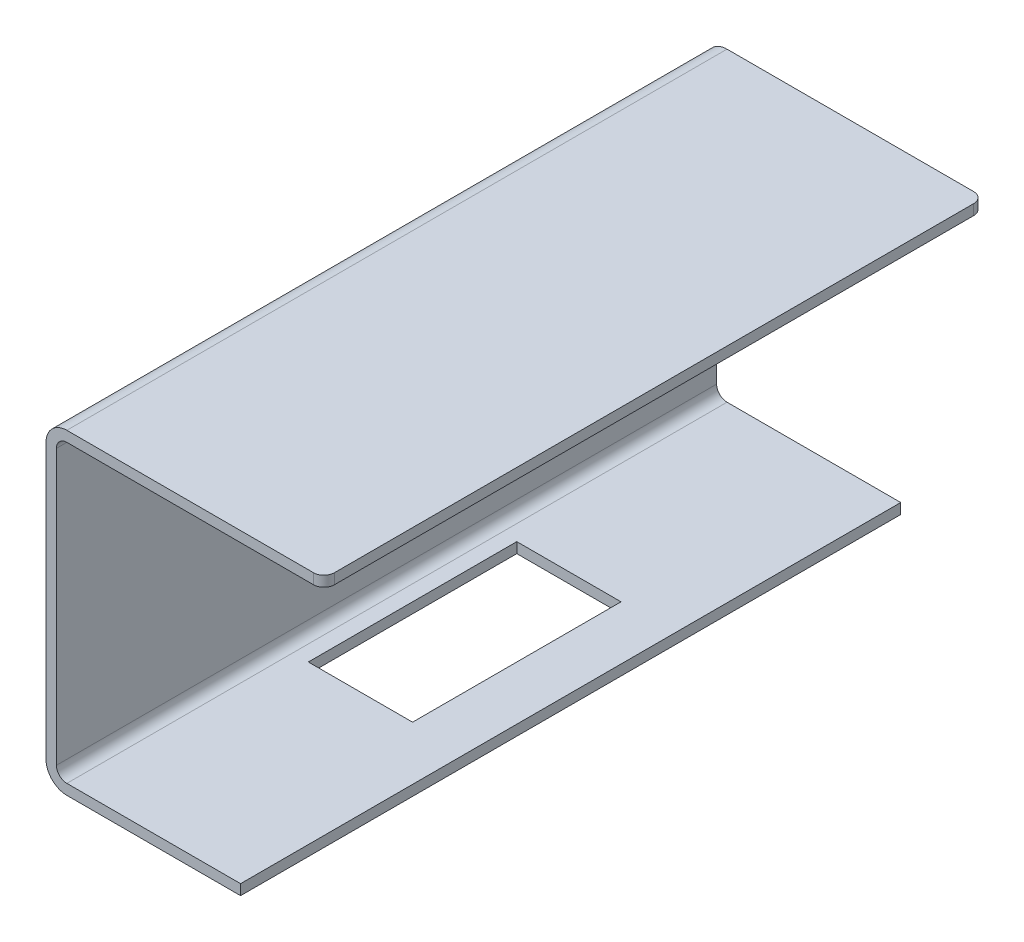
ISO-10303-21;
HEADER;
FILE_DESCRIPTION(('STEP AP214'),'2;1');
FILE_NAME('part.step','',(''),(''),'','','');
FILE_SCHEMA(('AUTOMOTIVE_DESIGN { 1 0 10303 214 1 1 1 1 }'));
ENDSEC;
DATA;
#1=APPLICATION_CONTEXT('core data for automotive mechanical design processes');
#2=APPLICATION_PROTOCOL_DEFINITION('international standard','automotive_design',2000,#1);
#3=PRODUCT_CONTEXT('',#1,'mechanical');
#4=PRODUCT('Part','Part','',(#3));
#5=PRODUCT_RELATED_PRODUCT_CATEGORY('part','',(#4));
#6=PRODUCT_DEFINITION_FORMATION('','',#4);
#7=PRODUCT_DEFINITION_CONTEXT('part definition',#1,'design');
#8=PRODUCT_DEFINITION('design','',#6,#7);
#9=PRODUCT_DEFINITION_SHAPE('','',#8);
#10=(LENGTH_UNIT() NAMED_UNIT(*) SI_UNIT(.MILLI.,.METRE.));
#11=(NAMED_UNIT(*) PLANE_ANGLE_UNIT() SI_UNIT($,.RADIAN.));
#12=(NAMED_UNIT(*) SI_UNIT($,.STERADIAN.) SOLID_ANGLE_UNIT());
#13=UNCERTAINTY_MEASURE_WITH_UNIT(LENGTH_MEASURE(1.E-05),#10,'distance_accuracy_value','');
#14=(GEOMETRIC_REPRESENTATION_CONTEXT(3) GLOBAL_UNCERTAINTY_ASSIGNED_CONTEXT((#13)) GLOBAL_UNIT_ASSIGNED_CONTEXT((#10,
#11,#12)) REPRESENTATION_CONTEXT('',''));
#15=CARTESIAN_POINT('',(0.,0.,0.));
#16=DIRECTION('',(0.,0.,1.));
#17=DIRECTION('',(1.,0.,0.));
#18=AXIS2_PLACEMENT_3D('',#15,#16,#17);
#19=CARTESIAN_POINT('',(6.,85.,95.));
#20=DIRECTION('',(0.,0.,-1.));
#21=DIRECTION('',(-1.,0.,0.));
#22=AXIS2_PLACEMENT_3D('',#19,#20,#21);
#23=CYLINDRICAL_SURFACE('',#22,3.);
#24=CARTESIAN_POINT('',(6.,85.,-95.));
#25=DIRECTION('',(0.,0.,-1.));
#26=DIRECTION('',(-1.,0.,0.));
#27=AXIS2_PLACEMENT_3D('',#24,#25,#26);
#28=CIRCLE('',#27,3.);
#29=CARTESIAN_POINT('',(3.,85.,-95.));
#30=VERTEX_POINT('',#29);
#31=CARTESIAN_POINT('',(6.,88.,-95.));
#32=VERTEX_POINT('',#31);
#33=EDGE_CURVE('E254',#30,#32,#28,.T.);
#34=ORIENTED_EDGE('',*,*,#33,.T.);
#35=DIRECTION('',(0.,0.,-1.));
#36=VECTOR('',#35,1.);
#37=CARTESIAN_POINT('',(6.,88.,95.));
#38=LINE('',#37,#36);
#39=CARTESIAN_POINT('',(6.,88.,95.));
#40=VERTEX_POINT('',#39);
#41=EDGE_CURVE('E335',#40,#32,#38,.T.);
#42=ORIENTED_EDGE('',*,*,#41,.F.);
#43=CARTESIAN_POINT('',(6.,85.,95.));
#44=DIRECTION('',(0.,0.,-1.));
#45=DIRECTION('',(-1.,0.,0.));
#46=AXIS2_PLACEMENT_3D('',#43,#44,#45);
#47=CIRCLE('',#46,3.);
#48=CARTESIAN_POINT('',(3.,85.,95.));
#49=VERTEX_POINT('',#48);
#50=EDGE_CURVE('E255',#49,#40,#47,.T.);
#51=ORIENTED_EDGE('',*,*,#50,.F.);
#52=DIRECTION('',(0.,0.,-1.));
#53=VECTOR('',#52,1.);
#54=CARTESIAN_POINT('',(3.,85.,95.));
#55=LINE('',#54,#53);
#56=EDGE_CURVE('E280',#49,#30,#55,.T.);
#57=ORIENTED_EDGE('',*,*,#56,.T.);
#58=EDGE_LOOP('',(#34,#42,#51,#57));
#59=FACE_BOUND('',#58,.T.);
#60=ADVANCED_FACE('F39',(#59),#23,.F.);
#61=CARTESIAN_POINT('',(6.,88.,95.));
#62=DIRECTION('',(0.,1.,0.));
#63=DIRECTION('',(0.,0.,1.));
#64=AXIS2_PLACEMENT_3D('',#61,#62,#63);
#65=PLANE('',#64);
#66=DIRECTION('',(0.,0.,-1.));
#67=VECTOR('',#66,1.);
#68=CARTESIAN_POINT('',(80.,88.,95.));
#69=LINE('',#68,#67);
#70=CARTESIAN_POINT('',(80.,88.,92.));
#71=VERTEX_POINT('',#70);
#72=CARTESIAN_POINT('',(80.,88.,-92.));
#73=VERTEX_POINT('',#72);
#74=EDGE_CURVE('E332',#71,#73,#69,.T.);
#75=ORIENTED_EDGE('',*,*,#74,.F.);
#76=CARTESIAN_POINT('',(77.,88.,92.));
#77=DIRECTION('',(0.,1.,0.));
#78=DIRECTION('',(0.,0.,1.));
#79=AXIS2_PLACEMENT_3D('',#76,#77,#78);
#80=CIRCLE('',#79,3.);
#81=CARTESIAN_POINT('',(77.,88.,95.));
#82=VERTEX_POINT('',#81);
#83=EDGE_CURVE('E47',#71,#82,#80,.F.);
#84=ORIENTED_EDGE('',*,*,#83,.T.);
#85=DIRECTION('',(1.,0.,0.));
#86=VECTOR('',#85,1.);
#87=CARTESIAN_POINT('',(6.,88.,95.));
#88=LINE('',#87,#86);
#89=EDGE_CURVE('E258',#40,#82,#88,.T.);
#90=ORIENTED_EDGE('',*,*,#89,.F.);
#91=ORIENTED_EDGE('',*,*,#41,.T.);
#92=DIRECTION('',(1.,0.,0.));
#93=VECTOR('',#92,1.);
#94=CARTESIAN_POINT('',(6.,88.,-95.));
#95=LINE('',#94,#93);
#96=CARTESIAN_POINT('',(77.,88.,-95.));
#97=VERTEX_POINT('',#96);
#98=EDGE_CURVE('E283',#32,#97,#95,.T.);
#99=ORIENTED_EDGE('',*,*,#98,.T.);
#100=CARTESIAN_POINT('',(77.,88.,-92.));
#101=DIRECTION('',(0.,1.,0.));
#102=DIRECTION('',(0.,0.,1.));
#103=AXIS2_PLACEMENT_3D('',#100,#101,#102);
#104=CIRCLE('',#103,3.);
#105=EDGE_CURVE('E350',#97,#73,#104,.F.);
#106=ORIENTED_EDGE('',*,*,#105,.T.);
#107=EDGE_LOOP('',(#75,#84,#90,#91,#99,#106));
#108=FACE_BOUND('',#107,.T.);
#109=ADVANCED_FACE('F354',(#108),#65,.F.);
#110=CARTESIAN_POINT('',(80.,91.,95.));
#111=DIRECTION('',(-1.,0.,0.));
#112=DIRECTION('',(0.,0.,1.));
#113=AXIS2_PLACEMENT_3D('',#110,#111,#112);
#114=PLANE('',#113);
#115=DIRECTION('',(0.,0.,-1.));
#116=VECTOR('',#115,1.);
#117=CARTESIAN_POINT('',(80.,91.,95.));
#118=LINE('',#117,#116);
#119=CARTESIAN_POINT('',(80.,91.,92.));
#120=VERTEX_POINT('',#119);
#121=CARTESIAN_POINT('',(80.,91.,-92.));
#122=VERTEX_POINT('',#121);
#123=EDGE_CURVE('E329',#120,#122,#118,.T.);
#124=ORIENTED_EDGE('',*,*,#123,.F.);
#125=DIRECTION('',(0.,1.,0.));
#126=VECTOR('',#125,1.);
#127=CARTESIAN_POINT('',(80.,91.,92.));
#128=LINE('',#127,#126);
#129=EDGE_CURVE('E348',#120,#71,#128,.F.);
#130=ORIENTED_EDGE('',*,*,#129,.T.);
#131=ORIENTED_EDGE('',*,*,#74,.T.);
#132=DIRECTION('',(0.,1.,0.));
#133=VECTOR('',#132,1.);
#134=CARTESIAN_POINT('',(80.,91.,-92.));
#135=LINE('',#134,#133);
#136=EDGE_CURVE('E345',#73,#122,#135,.T.);
#137=ORIENTED_EDGE('',*,*,#136,.T.);
#138=EDGE_LOOP('',(#124,#130,#131,#137));
#139=FACE_BOUND('',#138,.T.);
#140=ADVANCED_FACE('F369',(#139),#114,.F.);
#141=CARTESIAN_POINT('',(6.,91.,95.));
#142=DIRECTION('',(0.,-1.,0.));
#143=DIRECTION('',(0.,0.,-1.));
#144=AXIS2_PLACEMENT_3D('',#141,#142,#143);
#145=PLANE('',#144);
#146=DIRECTION('',(-1.,0.,0.));
#147=VECTOR('',#146,1.);
#148=CARTESIAN_POINT('',(6.,91.,95.));
#149=LINE('',#148,#147);
#150=CARTESIAN_POINT('',(77.,91.,95.));
#151=VERTEX_POINT('',#150);
#152=CARTESIAN_POINT('',(6.,91.,95.));
#153=VERTEX_POINT('',#152);
#154=EDGE_CURVE('E262',#151,#153,#149,.T.);
#155=ORIENTED_EDGE('',*,*,#154,.F.);
#156=CARTESIAN_POINT('',(77.,91.,92.));
#157=DIRECTION('',(0.,-1.,0.));
#158=DIRECTION('',(0.,0.,-1.));
#159=AXIS2_PLACEMENT_3D('',#156,#157,#158);
#160=CIRCLE('',#159,3.);
#161=EDGE_CURVE('E343',#151,#120,#160,.F.);
#162=ORIENTED_EDGE('',*,*,#161,.T.);
#163=ORIENTED_EDGE('',*,*,#123,.T.);
#164=CARTESIAN_POINT('',(77.,91.,-92.));
#165=DIRECTION('',(0.,-1.,0.));
#166=DIRECTION('',(0.,0.,-1.));
#167=AXIS2_PLACEMENT_3D('',#164,#165,#166);
#168=CIRCLE('',#167,3.);
#169=CARTESIAN_POINT('',(77.,91.,-95.));
#170=VERTEX_POINT('',#169);
#171=EDGE_CURVE('E341',#122,#170,#168,.F.);
#172=ORIENTED_EDGE('',*,*,#171,.T.);
#173=DIRECTION('',(-1.,0.,0.));
#174=VECTOR('',#173,1.);
#175=CARTESIAN_POINT('',(6.,91.,-95.));
#176=LINE('',#175,#174);
#177=CARTESIAN_POINT('',(6.,91.,-95.));
#178=VERTEX_POINT('',#177);
#179=EDGE_CURVE('E286',#170,#178,#176,.T.);
#180=ORIENTED_EDGE('',*,*,#179,.T.);
#181=DIRECTION('',(0.,0.,-1.));
#182=VECTOR('',#181,1.);
#183=CARTESIAN_POINT('',(6.,91.,95.));
#184=LINE('',#183,#182);
#185=EDGE_CURVE('E326',#153,#178,#184,.T.);
#186=ORIENTED_EDGE('',*,*,#185,.F.);
#187=EDGE_LOOP('',(#155,#162,#163,#172,#180,#186));
#188=FACE_BOUND('',#187,.T.);
#189=ADVANCED_FACE('F366',(#188),#145,.F.);
#190=CARTESIAN_POINT('',(6.,85.,95.));
#191=DIRECTION('',(0.,0.,-1.));
#192=DIRECTION('',(-1.,0.,0.));
#193=AXIS2_PLACEMENT_3D('',#190,#191,#192);
#194=CYLINDRICAL_SURFACE('',#193,6.);
#195=CARTESIAN_POINT('',(6.,85.,-95.));
#196=DIRECTION('',(0.,0.,1.));
#197=DIRECTION('',(-1.,0.,0.));
#198=AXIS2_PLACEMENT_3D('',#195,#196,#197);
#199=CIRCLE('',#198,6.);
#200=CARTESIAN_POINT('',(0.,85.,-95.));
#201=VERTEX_POINT('',#200);
#202=EDGE_CURVE('E288',#178,#201,#199,.T.);
#203=ORIENTED_EDGE('',*,*,#202,.T.);
#204=DIRECTION('',(0.,0.,-1.));
#205=VECTOR('',#204,1.);
#206=CARTESIAN_POINT('',(0.,85.,95.));
#207=LINE('',#206,#205);
#208=CARTESIAN_POINT('',(0.,85.,95.));
#209=VERTEX_POINT('',#208);
#210=EDGE_CURVE('E323',#209,#201,#207,.T.);
#211=ORIENTED_EDGE('',*,*,#210,.F.);
#212=CARTESIAN_POINT('',(6.,85.,95.));
#213=DIRECTION('',(0.,0.,1.));
#214=DIRECTION('',(-1.,0.,0.));
#215=AXIS2_PLACEMENT_3D('',#212,#213,#214);
#216=CIRCLE('',#215,6.);
#217=EDGE_CURVE('E264',#153,#209,#216,.T.);
#218=ORIENTED_EDGE('',*,*,#217,.F.);
#219=ORIENTED_EDGE('',*,*,#185,.T.);
#220=EDGE_LOOP('',(#203,#211,#218,#219));
#221=FACE_BOUND('',#220,.T.);
#222=ADVANCED_FACE('F382',(#221),#194,.T.);
#223=CARTESIAN_POINT('',(0.,6.00000000000004,95.));
#224=DIRECTION('',(1.,0.,0.));
#225=DIRECTION('',(0.,0.,-1.));
#226=AXIS2_PLACEMENT_3D('',#223,#224,#225);
#227=PLANE('',#226);
#228=CARTESIAN_POINT('',(0.,21.,17.5));
#229=DIRECTION('',(1.,0.,0.));
#230=DIRECTION('',(0.,0.,-1.));
#231=AXIS2_PLACEMENT_3D('',#228,#229,#230);
#232=CIRCLE('',#231,3.);
#233=CARTESIAN_POINT('',(0.,21.,14.5));
#234=VERTEX_POINT('',#233);
#235=EDGE_CURVE('E595',#234,#234,#232,.F.);
#236=ORIENTED_EDGE('',*,*,#235,.F.);
#237=EDGE_LOOP('',(#236));
#238=FACE_BOUND('',#237,.T.);
#239=CARTESIAN_POINT('',(0.,21.,-17.5));
#240=DIRECTION('',(1.,0.,0.));
#241=DIRECTION('',(0.,0.,-1.));
#242=AXIS2_PLACEMENT_3D('',#239,#240,#241);
#243=CIRCLE('',#242,3.);
#244=CARTESIAN_POINT('',(0.,21.,-20.5));
#245=VERTEX_POINT('',#244);
#246=EDGE_CURVE('E600',#245,#245,#243,.F.);
#247=ORIENTED_EDGE('',*,*,#246,.F.);
#248=EDGE_LOOP('',(#247));
#249=FACE_BOUND('',#248,.T.);
#250=DIRECTION('',(0.,0.,-1.));
#251=VECTOR('',#250,1.);
#252=CARTESIAN_POINT('',(0.,54.,12.5));
#253=LINE('',#252,#251);
#254=CARTESIAN_POINT('',(0.,54.,12.5));
#255=VERTEX_POINT('',#254);
#256=CARTESIAN_POINT('',(0.,54.,-12.5));
#257=VERTEX_POINT('',#256);
#258=EDGE_CURVE('E225',#255,#257,#253,.T.);
#259=ORIENTED_EDGE('',*,*,#258,.F.);
#260=CARTESIAN_POINT('',(0.,46.5,12.5));
#261=DIRECTION('',(1.,0.,0.));
#262=DIRECTION('',(0.,0.,-1.));
#263=AXIS2_PLACEMENT_3D('',#260,#261,#262);
#264=CIRCLE('',#263,7.5);
#265=CARTESIAN_POINT('',(0.,39.,12.5));
#266=VERTEX_POINT('',#265);
#267=EDGE_CURVE('E228',#266,#255,#264,.F.);
#268=ORIENTED_EDGE('',*,*,#267,.F.);
#269=DIRECTION('',(0.,0.,1.));
#270=VECTOR('',#269,1.);
#271=CARTESIAN_POINT('',(0.,39.,12.5));
#272=LINE('',#271,#270);
#273=CARTESIAN_POINT('',(0.,39.,-12.5));
#274=VERTEX_POINT('',#273);
#275=EDGE_CURVE('E245',#274,#266,#272,.T.);
#276=ORIENTED_EDGE('',*,*,#275,.F.);
#277=CARTESIAN_POINT('',(0.,46.5,-12.5));
#278=DIRECTION('',(1.,0.,0.));
#279=DIRECTION('',(0.,0.,-1.));
#280=AXIS2_PLACEMENT_3D('',#277,#278,#279);
#281=CIRCLE('',#280,7.5);
#282=EDGE_CURVE('E201',#257,#274,#281,.F.);
#283=ORIENTED_EDGE('',*,*,#282,.F.);
#284=EDGE_LOOP('',(#259,#268,#276,#283));
#285=FACE_BOUND('',#284,.T.);
#286=DIRECTION('',(0.,-1.,0.));
#287=VECTOR('',#286,1.);
#288=CARTESIAN_POINT('',(0.,6.00000000000004,-95.));
#289=LINE('',#288,#287);
#290=CARTESIAN_POINT('',(0.,6.,-95.));
#291=VERTEX_POINT('',#290);
#292=EDGE_CURVE('E290',#201,#291,#289,.T.);
#293=ORIENTED_EDGE('',*,*,#292,.T.);
#294=DIRECTION('',(0.,0.,-1.));
#295=VECTOR('',#294,1.);
#296=CARTESIAN_POINT('',(0.,6.,95.));
#297=LINE('',#296,#295);
#298=CARTESIAN_POINT('',(0.,6.,95.));
#299=VERTEX_POINT('',#298);
#300=EDGE_CURVE('E320',#299,#291,#297,.T.);
#301=ORIENTED_EDGE('',*,*,#300,.F.);
#302=DIRECTION('',(0.,-1.,0.));
#303=VECTOR('',#302,1.);
#304=CARTESIAN_POINT('',(0.,6.00000000000004,95.));
#305=LINE('',#304,#303);
#306=EDGE_CURVE('E266',#209,#299,#305,.T.);
#307=ORIENTED_EDGE('',*,*,#306,.F.);
#308=ORIENTED_EDGE('',*,*,#210,.T.);
#309=EDGE_LOOP('',(#293,#301,#307,#308));
#310=FACE_BOUND('',#309,.T.);
#311=ADVANCED_FACE('F386',(#238,#249,#285,#310),#227,.F.);
#312=CARTESIAN_POINT('',(6.,6.,95.));
#313=DIRECTION('',(0.,0.,-1.));
#314=DIRECTION('',(-1.,0.,0.));
#315=AXIS2_PLACEMENT_3D('',#312,#313,#314);
#316=CYLINDRICAL_SURFACE('',#315,6.);
#317=CARTESIAN_POINT('',(6.,6.,-95.));
#318=DIRECTION('',(0.,0.,1.));
#319=DIRECTION('',(-1.,0.,0.));
#320=AXIS2_PLACEMENT_3D('',#317,#318,#319);
#321=CIRCLE('',#320,6.);
#322=CARTESIAN_POINT('',(6.00000000000004,0.,-95.));
#323=VERTEX_POINT('',#322);
#324=EDGE_CURVE('E292',#291,#323,#321,.T.);
#325=ORIENTED_EDGE('',*,*,#324,.T.);
#326=DIRECTION('',(0.,0.,-1.));
#327=VECTOR('',#326,1.);
#328=CARTESIAN_POINT('',(6.00000000000004,0.,95.));
#329=LINE('',#328,#327);
#330=CARTESIAN_POINT('',(6.00000000000004,0.,95.));
#331=VERTEX_POINT('',#330);
#332=EDGE_CURVE('E317',#331,#323,#329,.T.);
#333=ORIENTED_EDGE('',*,*,#332,.F.);
#334=CARTESIAN_POINT('',(6.,6.,95.));
#335=DIRECTION('',(0.,0.,1.));
#336=DIRECTION('',(-1.,0.,0.));
#337=AXIS2_PLACEMENT_3D('',#334,#335,#336);
#338=CIRCLE('',#337,6.);
#339=EDGE_CURVE('E268',#299,#331,#338,.T.);
#340=ORIENTED_EDGE('',*,*,#339,.F.);
#341=ORIENTED_EDGE('',*,*,#300,.T.);
#342=EDGE_LOOP('',(#325,#333,#340,#341));
#343=FACE_BOUND('',#342,.T.);
#344=ADVANCED_FACE('F393',(#343),#316,.T.);
#345=CARTESIAN_POINT('',(6.00000000000004,0.,95.));
#346=DIRECTION('',(0.,1.,0.));
#347=DIRECTION('',(0.,0.,1.));
#348=AXIS2_PLACEMENT_3D('',#345,#346,#347);
#349=PLANE('',#348);
#350=DIRECTION('',(1.,0.,0.));
#351=VECTOR('',#350,1.);
#352=CARTESIAN_POINT('',(10.5,0.,-30.));
#353=LINE('',#352,#351);
#354=CARTESIAN_POINT('',(10.5,0.,-30.));
#355=VERTEX_POINT('',#354);
#356=CARTESIAN_POINT('',(40.5,0.,-30.));
#357=VERTEX_POINT('',#356);
#358=EDGE_CURVE('E207',#355,#357,#353,.T.);
#359=ORIENTED_EDGE('',*,*,#358,.F.);
#360=DIRECTION('',(0.,0.,-1.));
#361=VECTOR('',#360,1.);
#362=CARTESIAN_POINT('',(10.5,0.,-30.));
#363=LINE('',#362,#361);
#364=CARTESIAN_POINT('',(10.5,0.,30.));
#365=VERTEX_POINT('',#364);
#366=EDGE_CURVE('E189',#365,#355,#363,.T.);
#367=ORIENTED_EDGE('',*,*,#366,.F.);
#368=DIRECTION('',(-1.,0.,0.));
#369=VECTOR('',#368,1.);
#370=CARTESIAN_POINT('',(10.5,0.,30.));
#371=LINE('',#370,#369);
#372=CARTESIAN_POINT('',(40.5,0.,30.));
#373=VERTEX_POINT('',#372);
#374=EDGE_CURVE('E198',#373,#365,#371,.T.);
#375=ORIENTED_EDGE('',*,*,#374,.F.);
#376=DIRECTION('',(0.,0.,1.));
#377=VECTOR('',#376,1.);
#378=CARTESIAN_POINT('',(40.5,0.,-30.));
#379=LINE('',#378,#377);
#380=EDGE_CURVE('E54',#357,#373,#379,.T.);
#381=ORIENTED_EDGE('',*,*,#380,.F.);
#382=EDGE_LOOP('',(#359,#367,#375,#381));
#383=FACE_BOUND('',#382,.T.);
#384=DIRECTION('',(1.,0.,0.));
#385=VECTOR('',#384,1.);
#386=CARTESIAN_POINT('',(6.00000000000004,0.,-95.));
#387=LINE('',#386,#385);
#388=CARTESIAN_POINT('',(56.,0.,-95.));
#389=VERTEX_POINT('',#388);
#390=EDGE_CURVE('E294',#323,#389,#387,.T.);
#391=ORIENTED_EDGE('',*,*,#390,.T.);
#392=DIRECTION('',(0.,0.,-1.));
#393=VECTOR('',#392,1.);
#394=CARTESIAN_POINT('',(56.,0.,95.));
#395=LINE('',#394,#393);
#396=CARTESIAN_POINT('',(56.,0.,95.));
#397=VERTEX_POINT('',#396);
#398=EDGE_CURVE('E314',#397,#389,#395,.T.);
#399=ORIENTED_EDGE('',*,*,#398,.F.);
#400=DIRECTION('',(1.,0.,0.));
#401=VECTOR('',#400,1.);
#402=CARTESIAN_POINT('',(6.00000000000004,0.,95.));
#403=LINE('',#402,#401);
#404=EDGE_CURVE('E270',#331,#397,#403,.T.);
#405=ORIENTED_EDGE('',*,*,#404,.F.);
#406=ORIENTED_EDGE('',*,*,#332,.T.);
#407=EDGE_LOOP('',(#391,#399,#405,#406));
#408=FACE_BOUND('',#407,.T.);
#409=ADVANCED_FACE('F204',(#383,#408),#349,.F.);
#410=CARTESIAN_POINT('',(56.,3.,95.));
#411=DIRECTION('',(-1.,0.,0.));
#412=DIRECTION('',(0.,0.,1.));
#413=AXIS2_PLACEMENT_3D('',#410,#411,#412);
#414=PLANE('',#413);
#415=DIRECTION('',(0.,1.,0.));
#416=VECTOR('',#415,1.);
#417=CARTESIAN_POINT('',(56.,3.,-95.));
#418=LINE('',#417,#416);
#419=CARTESIAN_POINT('',(56.,3.,-95.));
#420=VERTEX_POINT('',#419);
#421=EDGE_CURVE('E296',#389,#420,#418,.T.);
#422=ORIENTED_EDGE('',*,*,#421,.T.);
#423=DIRECTION('',(0.,0.,-1.));
#424=VECTOR('',#423,1.);
#425=CARTESIAN_POINT('',(56.,3.,95.));
#426=LINE('',#425,#424);
#427=CARTESIAN_POINT('',(56.,3.,95.));
#428=VERTEX_POINT('',#427);
#429=EDGE_CURVE('E311',#428,#420,#426,.T.);
#430=ORIENTED_EDGE('',*,*,#429,.F.);
#431=DIRECTION('',(0.,1.,0.));
#432=VECTOR('',#431,1.);
#433=CARTESIAN_POINT('',(56.,3.,95.));
#434=LINE('',#433,#432);
#435=EDGE_CURVE('E272',#397,#428,#434,.T.);
#436=ORIENTED_EDGE('',*,*,#435,.F.);
#437=ORIENTED_EDGE('',*,*,#398,.T.);
#438=EDGE_LOOP('',(#422,#430,#436,#437));
#439=FACE_BOUND('',#438,.T.);
#440=ADVANCED_FACE('F399',(#439),#414,.F.);
#441=CARTESIAN_POINT('',(6.00000000000002,3.,95.));
#442=DIRECTION('',(0.,-1.,0.));
#443=DIRECTION('',(0.,0.,-1.));
#444=AXIS2_PLACEMENT_3D('',#441,#442,#443);
#445=PLANE('',#444);
#446=DIRECTION('',(1.,0.,0.));
#447=VECTOR('',#446,1.);
#448=CARTESIAN_POINT('',(10.5,3.,30.));
#449=LINE('',#448,#447);
#450=CARTESIAN_POINT('',(10.5,3.,30.));
#451=VERTEX_POINT('',#450);
#452=CARTESIAN_POINT('',(40.5,3.,30.));
#453=VERTEX_POINT('',#452);
#454=EDGE_CURVE('E209',#451,#453,#449,.T.);
#455=ORIENTED_EDGE('',*,*,#454,.F.);
#456=DIRECTION('',(0.,0.,1.));
#457=VECTOR('',#456,1.);
#458=CARTESIAN_POINT('',(10.5,3.,-30.));
#459=LINE('',#458,#457);
#460=CARTESIAN_POINT('',(10.5,3.,-30.));
#461=VERTEX_POINT('',#460);
#462=EDGE_CURVE('E62',#461,#451,#459,.T.);
#463=ORIENTED_EDGE('',*,*,#462,.F.);
#464=DIRECTION('',(-1.,0.,0.));
#465=VECTOR('',#464,1.);
#466=CARTESIAN_POINT('',(10.5,3.,-30.));
#467=LINE('',#466,#465);
#468=CARTESIAN_POINT('',(40.5,3.,-30.));
#469=VERTEX_POINT('',#468);
#470=EDGE_CURVE('E195',#469,#461,#467,.T.);
#471=ORIENTED_EDGE('',*,*,#470,.F.);
#472=DIRECTION('',(0.,0.,-1.));
#473=VECTOR('',#472,1.);
#474=CARTESIAN_POINT('',(40.5,3.,-30.));
#475=LINE('',#474,#473);
#476=EDGE_CURVE('E215',#453,#469,#475,.T.);
#477=ORIENTED_EDGE('',*,*,#476,.F.);
#478=EDGE_LOOP('',(#455,#463,#471,#477));
#479=FACE_BOUND('',#478,.T.);
#480=DIRECTION('',(-1.,0.,0.));
#481=VECTOR('',#480,1.);
#482=CARTESIAN_POINT('',(6.00000000000002,3.,-95.));
#483=LINE('',#482,#481);
#484=CARTESIAN_POINT('',(6.00000000000002,3.,-95.));
#485=VERTEX_POINT('',#484);
#486=EDGE_CURVE('E298',#420,#485,#483,.T.);
#487=ORIENTED_EDGE('',*,*,#486,.T.);
#488=DIRECTION('',(0.,0.,-1.));
#489=VECTOR('',#488,1.);
#490=CARTESIAN_POINT('',(6.00000000000002,3.,95.));
#491=LINE('',#490,#489);
#492=CARTESIAN_POINT('',(6.00000000000002,3.,95.));
#493=VERTEX_POINT('',#492);
#494=EDGE_CURVE('E308',#493,#485,#491,.T.);
#495=ORIENTED_EDGE('',*,*,#494,.F.);
#496=DIRECTION('',(-1.,0.,0.));
#497=VECTOR('',#496,1.);
#498=CARTESIAN_POINT('',(6.00000000000002,3.,95.));
#499=LINE('',#498,#497);
#500=EDGE_CURVE('E274',#428,#493,#499,.T.);
#501=ORIENTED_EDGE('',*,*,#500,.F.);
#502=ORIENTED_EDGE('',*,*,#429,.T.);
#503=EDGE_LOOP('',(#487,#495,#501,#502));
#504=FACE_BOUND('',#503,.T.);
#505=ADVANCED_FACE('F405',(#479,#504),#445,.F.);
#506=CARTESIAN_POINT('',(6.,6.,95.));
#507=DIRECTION('',(0.,0.,-1.));
#508=DIRECTION('',(-1.,0.,0.));
#509=AXIS2_PLACEMENT_3D('',#506,#507,#508);
#510=CYLINDRICAL_SURFACE('',#509,3.);
#511=CARTESIAN_POINT('',(6.,6.,-95.));
#512=DIRECTION('',(0.,0.,-1.));
#513=DIRECTION('',(-1.,0.,0.));
#514=AXIS2_PLACEMENT_3D('',#511,#512,#513);
#515=CIRCLE('',#514,3.);
#516=CARTESIAN_POINT('',(3.,6.00000000000002,-95.));
#517=VERTEX_POINT('',#516);
#518=EDGE_CURVE('E300',#485,#517,#515,.T.);
#519=ORIENTED_EDGE('',*,*,#518,.T.);
#520=DIRECTION('',(0.,0.,-1.));
#521=VECTOR('',#520,1.);
#522=CARTESIAN_POINT('',(3.,6.00000000000002,95.));
#523=LINE('',#522,#521);
#524=CARTESIAN_POINT('',(3.,6.00000000000002,95.));
#525=VERTEX_POINT('',#524);
#526=EDGE_CURVE('E305',#525,#517,#523,.T.);
#527=ORIENTED_EDGE('',*,*,#526,.F.);
#528=CARTESIAN_POINT('',(6.,6.,95.));
#529=DIRECTION('',(0.,0.,-1.));
#530=DIRECTION('',(-1.,0.,0.));
#531=AXIS2_PLACEMENT_3D('',#528,#529,#530);
#532=CIRCLE('',#531,3.);
#533=EDGE_CURVE('E276',#493,#525,#532,.T.);
#534=ORIENTED_EDGE('',*,*,#533,.F.);
#535=ORIENTED_EDGE('',*,*,#494,.T.);
#536=EDGE_LOOP('',(#519,#527,#534,#535));
#537=FACE_BOUND('',#536,.T.);
#538=ADVANCED_FACE('F409',(#537),#510,.F.);
#539=CARTESIAN_POINT('',(3.,6.00000000000002,95.));
#540=DIRECTION('',(-1.,0.,0.));
#541=DIRECTION('',(0.,0.,1.));
#542=AXIS2_PLACEMENT_3D('',#539,#540,#541);
#543=PLANE('',#542);
#544=CARTESIAN_POINT('',(3.,21.,17.5));
#545=DIRECTION('',(1.,0.,0.));
#546=DIRECTION('',(0.,0.,-1.));
#547=AXIS2_PLACEMENT_3D('',#544,#545,#546);
#548=CIRCLE('',#547,3.);
#549=CARTESIAN_POINT('',(3.,21.,14.5));
#550=VERTEX_POINT('',#549);
#551=EDGE_CURVE('E592',#550,#550,#548,.T.);
#552=ORIENTED_EDGE('',*,*,#551,.F.);
#553=EDGE_LOOP('',(#552));
#554=FACE_BOUND('',#553,.T.);
#555=CARTESIAN_POINT('',(3.,21.,-17.5));
#556=DIRECTION('',(1.,0.,0.));
#557=DIRECTION('',(0.,0.,-1.));
#558=AXIS2_PLACEMENT_3D('',#555,#556,#557);
#559=CIRCLE('',#558,3.);
#560=CARTESIAN_POINT('',(3.,21.,-20.5));
#561=VERTEX_POINT('',#560);
#562=EDGE_CURVE('E597',#561,#561,#559,.T.);
#563=ORIENTED_EDGE('',*,*,#562,.F.);
#564=EDGE_LOOP('',(#563));
#565=FACE_BOUND('',#564,.T.);
#566=DIRECTION('',(0.,0.,-1.));
#567=VECTOR('',#566,1.);
#568=CARTESIAN_POINT('',(3.,39.,12.5));
#569=LINE('',#568,#567);
#570=CARTESIAN_POINT('',(3.,39.,12.5));
#571=VERTEX_POINT('',#570);
#572=CARTESIAN_POINT('',(3.,39.,-12.5));
#573=VERTEX_POINT('',#572);
#574=EDGE_CURVE('E233',#571,#573,#569,.T.);
#575=ORIENTED_EDGE('',*,*,#574,.F.);
#576=CARTESIAN_POINT('',(3.,46.5,12.5));
#577=DIRECTION('',(1.,0.,0.));
#578=DIRECTION('',(0.,0.,-1.));
#579=AXIS2_PLACEMENT_3D('',#576,#577,#578);
#580=CIRCLE('',#579,7.5);
#581=CARTESIAN_POINT('',(3.,54.,12.5));
#582=VERTEX_POINT('',#581);
#583=EDGE_CURVE('E231',#582,#571,#580,.T.);
#584=ORIENTED_EDGE('',*,*,#583,.F.);
#585=DIRECTION('',(0.,0.,1.));
#586=VECTOR('',#585,1.);
#587=CARTESIAN_POINT('',(3.,54.,12.5));
#588=LINE('',#587,#586);
#589=CARTESIAN_POINT('',(3.,54.,-12.5));
#590=VERTEX_POINT('',#589);
#591=EDGE_CURVE('E239',#590,#582,#588,.T.);
#592=ORIENTED_EDGE('',*,*,#591,.F.);
#593=CARTESIAN_POINT('',(3.,46.5,-12.5));
#594=DIRECTION('',(1.,0.,0.));
#595=DIRECTION('',(0.,0.,-1.));
#596=AXIS2_PLACEMENT_3D('',#593,#594,#595);
#597=CIRCLE('',#596,7.5);
#598=EDGE_CURVE('E236',#573,#590,#597,.T.);
#599=ORIENTED_EDGE('',*,*,#598,.F.);
#600=EDGE_LOOP('',(#575,#584,#592,#599));
#601=FACE_BOUND('',#600,.T.);
#602=DIRECTION('',(0.,1.,0.));
#603=VECTOR('',#602,1.);
#604=CARTESIAN_POINT('',(3.,6.00000000000002,-95.));
#605=LINE('',#604,#603);
#606=EDGE_CURVE('E259',#517,#30,#605,.T.);
#607=ORIENTED_EDGE('',*,*,#606,.T.);
#608=ORIENTED_EDGE('',*,*,#56,.F.);
#609=DIRECTION('',(0.,1.,0.));
#610=VECTOR('',#609,1.);
#611=CARTESIAN_POINT('',(3.,6.00000000000002,95.));
#612=LINE('',#611,#610);
#613=EDGE_CURVE('E278',#525,#49,#612,.T.);
#614=ORIENTED_EDGE('',*,*,#613,.F.);
#615=ORIENTED_EDGE('',*,*,#526,.T.);
#616=EDGE_LOOP('',(#607,#608,#614,#615));
#617=FACE_BOUND('',#616,.T.);
#618=ADVANCED_FACE('F414',(#554,#565,#601,#617),#543,.F.);
#619=CARTESIAN_POINT('',(6.,85.,95.));
#620=DIRECTION('',(0.,0.,-1.));
#621=DIRECTION('',(-1.,0.,0.));
#622=AXIS2_PLACEMENT_3D('',#619,#620,#621);
#623=PLANE('',#622);
#624=ORIENTED_EDGE('',*,*,#89,.T.);
#625=DIRECTION('',(0.,1.,0.));
#626=VECTOR('',#625,1.);
#627=CARTESIAN_POINT('',(77.,85.,95.));
#628=LINE('',#627,#626);
#629=EDGE_CURVE('E338',#82,#151,#628,.T.);
#630=ORIENTED_EDGE('',*,*,#629,.T.);
#631=ORIENTED_EDGE('',*,*,#154,.T.);
#632=ORIENTED_EDGE('',*,*,#217,.T.);
#633=ORIENTED_EDGE('',*,*,#306,.T.);
#634=ORIENTED_EDGE('',*,*,#339,.T.);
#635=ORIENTED_EDGE('',*,*,#404,.T.);
#636=ORIENTED_EDGE('',*,*,#435,.T.);
#637=ORIENTED_EDGE('',*,*,#500,.T.);
#638=ORIENTED_EDGE('',*,*,#533,.T.);
#639=ORIENTED_EDGE('',*,*,#613,.T.);
#640=ORIENTED_EDGE('',*,*,#50,.T.);
#641=EDGE_LOOP('',(#624,#630,#631,#632,#633,#634,#635,#636,#637,#638,#639,#640));
#642=FACE_BOUND('',#641,.T.);
#643=ADVANCED_FACE('F359',(#642),#623,.F.);
#644=CARTESIAN_POINT('',(6.,85.,-95.));
#645=DIRECTION('',(0.,0.,-1.));
#646=DIRECTION('',(-1.,0.,0.));
#647=AXIS2_PLACEMENT_3D('',#644,#645,#646);
#648=PLANE('',#647);
#649=ORIENTED_EDGE('',*,*,#179,.F.);
#650=DIRECTION('',(0.,1.,0.));
#651=VECTOR('',#650,1.);
#652=CARTESIAN_POINT('',(77.,88.,-95.));
#653=LINE('',#652,#651);
#654=EDGE_CURVE('E11',#170,#97,#653,.F.);
#655=ORIENTED_EDGE('',*,*,#654,.T.);
#656=ORIENTED_EDGE('',*,*,#98,.F.);
#657=ORIENTED_EDGE('',*,*,#33,.F.);
#658=ORIENTED_EDGE('',*,*,#606,.F.);
#659=ORIENTED_EDGE('',*,*,#518,.F.);
#660=ORIENTED_EDGE('',*,*,#486,.F.);
#661=ORIENTED_EDGE('',*,*,#421,.F.);
#662=ORIENTED_EDGE('',*,*,#390,.F.);
#663=ORIENTED_EDGE('',*,*,#324,.F.);
#664=ORIENTED_EDGE('',*,*,#292,.F.);
#665=ORIENTED_EDGE('',*,*,#202,.F.);
#666=EDGE_LOOP('',(#649,#655,#656,#657,#658,#659,#660,#661,#662,#663,#664,#665));
#667=FACE_BOUND('',#666,.T.);
#668=ADVANCED_FACE('F377',(#667),#648,.T.);
#669=CARTESIAN_POINT('',(77.,85.,92.));
#670=DIRECTION('',(0.,1.,0.));
#671=DIRECTION('',(0.,0.,1.));
#672=AXIS2_PLACEMENT_3D('',#669,#670,#671);
#673=CYLINDRICAL_SURFACE('',#672,3.);
#674=ORIENTED_EDGE('',*,*,#83,.F.);
#675=ORIENTED_EDGE('',*,*,#129,.F.);
#676=ORIENTED_EDGE('',*,*,#161,.F.);
#677=ORIENTED_EDGE('',*,*,#629,.F.);
#678=EDGE_LOOP('',(#674,#675,#676,#677));
#679=FACE_BOUND('',#678,.T.);
#680=ADVANCED_FACE('F363',(#679),#673,.T.);
#681=CARTESIAN_POINT('',(77.,91.,-92.));
#682=DIRECTION('',(0.,-1.,0.));
#683=DIRECTION('',(0.,0.,-1.));
#684=AXIS2_PLACEMENT_3D('',#681,#682,#683);
#685=CYLINDRICAL_SURFACE('',#684,3.);
#686=ORIENTED_EDGE('',*,*,#105,.F.);
#687=ORIENTED_EDGE('',*,*,#654,.F.);
#688=ORIENTED_EDGE('',*,*,#171,.F.);
#689=ORIENTED_EDGE('',*,*,#136,.F.);
#690=EDGE_LOOP('',(#686,#687,#688,#689));
#691=FACE_BOUND('',#690,.T.);
#692=ADVANCED_FACE('F41',(#691),#685,.T.);
#693=CARTESIAN_POINT('',(-0.00100000000000273,46.5,12.5));
#694=DIRECTION('',(1.,0.,0.));
#695=DIRECTION('',(0.,0.,-1.));
#696=AXIS2_PLACEMENT_3D('',#693,#694,#695);
#697=CYLINDRICAL_SURFACE('',#696,7.5);
#698=ORIENTED_EDGE('',*,*,#267,.T.);
#699=DIRECTION('',(1.,0.,0.));
#700=VECTOR('',#699,1.);
#701=CARTESIAN_POINT('',(-0.00100000000000273,54.,12.5));
#702=LINE('',#701,#700);
#703=EDGE_CURVE('E243',#255,#582,#702,.T.);
#704=ORIENTED_EDGE('',*,*,#703,.T.);
#705=ORIENTED_EDGE('',*,*,#583,.T.);
#706=DIRECTION('',(1.,0.,0.));
#707=VECTOR('',#706,1.);
#708=CARTESIAN_POINT('',(-0.00100000000000273,39.,12.5));
#709=LINE('',#708,#707);
#710=EDGE_CURVE('E242',#266,#571,#709,.T.);
#711=ORIENTED_EDGE('',*,*,#710,.F.);
#712=EDGE_LOOP('',(#698,#704,#705,#711));
#713=FACE_BOUND('',#712,.T.);
#714=ADVANCED_FACE('F430',(#713),#697,.F.);
#715=CARTESIAN_POINT('',(-0.00100000000000273,54.,12.5));
#716=DIRECTION('',(0.,1.,0.));
#717=DIRECTION('',(0.,0.,1.));
#718=AXIS2_PLACEMENT_3D('',#715,#716,#717);
#719=PLANE('',#718);
#720=ORIENTED_EDGE('',*,*,#258,.T.);
#721=DIRECTION('',(1.,0.,0.));
#722=VECTOR('',#721,1.);
#723=CARTESIAN_POINT('',(-0.00100000000000273,54.,-12.5));
#724=LINE('',#723,#722);
#725=EDGE_CURVE('E246',#257,#590,#724,.T.);
#726=ORIENTED_EDGE('',*,*,#725,.T.);
#727=ORIENTED_EDGE('',*,*,#591,.T.);
#728=ORIENTED_EDGE('',*,*,#703,.F.);
#729=EDGE_LOOP('',(#720,#726,#727,#728));
#730=FACE_BOUND('',#729,.T.);
#731=ADVANCED_FACE('F502',(#730),#719,.F.);
#732=CARTESIAN_POINT('',(-0.00100000000000273,46.5,-12.5));
#733=DIRECTION('',(1.,0.,0.));
#734=DIRECTION('',(0.,0.,-1.));
#735=AXIS2_PLACEMENT_3D('',#732,#733,#734);
#736=CYLINDRICAL_SURFACE('',#735,7.5);
#737=ORIENTED_EDGE('',*,*,#282,.T.);
#738=DIRECTION('',(1.,0.,0.));
#739=VECTOR('',#738,1.);
#740=CARTESIAN_POINT('',(-0.00100000000000273,39.,-12.5));
#741=LINE('',#740,#739);
#742=EDGE_CURVE('E248',#274,#573,#741,.T.);
#743=ORIENTED_EDGE('',*,*,#742,.T.);
#744=ORIENTED_EDGE('',*,*,#598,.T.);
#745=ORIENTED_EDGE('',*,*,#725,.F.);
#746=EDGE_LOOP('',(#737,#743,#744,#745));
#747=FACE_BOUND('',#746,.T.);
#748=ADVANCED_FACE('F511',(#747),#736,.F.);
#749=CARTESIAN_POINT('',(-0.00100000000000273,39.,12.5));
#750=DIRECTION('',(0.,-1.,0.));
#751=DIRECTION('',(0.,0.,-1.));
#752=AXIS2_PLACEMENT_3D('',#749,#750,#751);
#753=PLANE('',#752);
#754=ORIENTED_EDGE('',*,*,#275,.T.);
#755=ORIENTED_EDGE('',*,*,#710,.T.);
#756=ORIENTED_EDGE('',*,*,#574,.T.);
#757=ORIENTED_EDGE('',*,*,#742,.F.);
#758=EDGE_LOOP('',(#754,#755,#756,#757));
#759=FACE_BOUND('',#758,.T.);
#760=ADVANCED_FACE('F521',(#759),#753,.F.);
#761=CARTESIAN_POINT('',(10.5,-0.00100000000000013,-30.));
#762=DIRECTION('',(-1.,0.,0.));
#763=DIRECTION('',(0.,0.,1.));
#764=AXIS2_PLACEMENT_3D('',#761,#762,#763);
#765=PLANE('',#764);
#766=ORIENTED_EDGE('',*,*,#366,.T.);
#767=DIRECTION('',(0.,1.,0.));
#768=VECTOR('',#767,1.);
#769=CARTESIAN_POINT('',(10.5,-0.00100000000000013,-30.));
#770=LINE('',#769,#768);
#771=EDGE_CURVE('E202',#355,#461,#770,.T.);
#772=ORIENTED_EDGE('',*,*,#771,.T.);
#773=ORIENTED_EDGE('',*,*,#462,.T.);
#774=DIRECTION('',(0.,1.,0.));
#775=VECTOR('',#774,1.);
#776=CARTESIAN_POINT('',(10.5,-0.00100000000000013,30.));
#777=LINE('',#776,#775);
#778=EDGE_CURVE('E185',#365,#451,#777,.T.);
#779=ORIENTED_EDGE('',*,*,#778,.F.);
#780=EDGE_LOOP('',(#766,#772,#773,#779));
#781=FACE_BOUND('',#780,.T.);
#782=ADVANCED_FACE('F187',(#781),#765,.F.);
#783=CARTESIAN_POINT('',(10.5,-0.00100000000000013,-30.));
#784=DIRECTION('',(0.,0.,-1.));
#785=DIRECTION('',(-1.,0.,0.));
#786=AXIS2_PLACEMENT_3D('',#783,#784,#785);
#787=PLANE('',#786);
#788=ORIENTED_EDGE('',*,*,#358,.T.);
#789=DIRECTION('',(0.,1.,0.));
#790=VECTOR('',#789,1.);
#791=CARTESIAN_POINT('',(40.5,-0.00100000000000013,-30.));
#792=LINE('',#791,#790);
#793=EDGE_CURVE('E221',#357,#469,#792,.T.);
#794=ORIENTED_EDGE('',*,*,#793,.T.);
#795=ORIENTED_EDGE('',*,*,#470,.T.);
#796=ORIENTED_EDGE('',*,*,#771,.F.);
#797=EDGE_LOOP('',(#788,#794,#795,#796));
#798=FACE_BOUND('',#797,.T.);
#799=ADVANCED_FACE('F540',(#798),#787,.F.);
#800=CARTESIAN_POINT('',(40.5,-0.00100000000000013,-30.));
#801=DIRECTION('',(1.,0.,0.));
#802=DIRECTION('',(0.,0.,-1.));
#803=AXIS2_PLACEMENT_3D('',#800,#801,#802);
#804=PLANE('',#803);
#805=ORIENTED_EDGE('',*,*,#380,.T.);
#806=DIRECTION('',(0.,1.,0.));
#807=VECTOR('',#806,1.);
#808=CARTESIAN_POINT('',(40.5,-0.00100000000000013,30.));
#809=LINE('',#808,#807);
#810=EDGE_CURVE('E194',#373,#453,#809,.T.);
#811=ORIENTED_EDGE('',*,*,#810,.T.);
#812=ORIENTED_EDGE('',*,*,#476,.T.);
#813=ORIENTED_EDGE('',*,*,#793,.F.);
#814=EDGE_LOOP('',(#805,#811,#812,#813));
#815=FACE_BOUND('',#814,.T.);
#816=ADVANCED_FACE('F549',(#815),#804,.F.);
#817=CARTESIAN_POINT('',(10.5,-0.00100000000000013,30.));
#818=DIRECTION('',(0.,0.,1.));
#819=DIRECTION('',(1.,0.,0.));
#820=AXIS2_PLACEMENT_3D('',#817,#818,#819);
#821=PLANE('',#820);
#822=ORIENTED_EDGE('',*,*,#374,.T.);
#823=ORIENTED_EDGE('',*,*,#778,.T.);
#824=ORIENTED_EDGE('',*,*,#454,.T.);
#825=ORIENTED_EDGE('',*,*,#810,.F.);
#826=EDGE_LOOP('',(#822,#823,#824,#825));
#827=FACE_BOUND('',#826,.T.);
#828=ADVANCED_FACE('F199',(#827),#821,.F.);
#829=CARTESIAN_POINT('',(-0.00100000000000273,21.,-17.5));
#830=DIRECTION('',(1.,0.,0.));
#831=DIRECTION('',(0.,0.,-1.));
#832=AXIS2_PLACEMENT_3D('',#829,#830,#831);
#833=CYLINDRICAL_SURFACE('',#832,3.);
#834=CARTESIAN_POINT('',(3.,21.,-20.5));
#835=CARTESIAN_POINT('',(2.96875,21.,-20.5));
#836=CARTESIAN_POINT('',(2.9375,21.,-20.5));
#837=CARTESIAN_POINT('',(2.875,21.,-20.5));
#838=CARTESIAN_POINT('',(2.84375,21.,-20.5));
#839=CARTESIAN_POINT('',(2.78125,21.,-20.5));
#840=CARTESIAN_POINT('',(2.75,21.,-20.5));
#841=CARTESIAN_POINT('',(2.6875,21.,-20.5));
#842=CARTESIAN_POINT('',(2.65625,21.,-20.5));
#843=CARTESIAN_POINT('',(2.59375,21.,-20.5));
#844=CARTESIAN_POINT('',(2.5625,21.,-20.5));
#845=CARTESIAN_POINT('',(2.5,21.,-20.5));
#846=CARTESIAN_POINT('',(2.46875,21.,-20.5));
#847=CARTESIAN_POINT('',(2.40625,21.,-20.5));
#848=CARTESIAN_POINT('',(2.375,21.,-20.5));
#849=CARTESIAN_POINT('',(2.3125,21.,-20.5));
#850=CARTESIAN_POINT('',(2.28125,21.,-20.5));
#851=CARTESIAN_POINT('',(2.21875,21.,-20.5));
#852=CARTESIAN_POINT('',(2.1875,21.,-20.5));
#853=CARTESIAN_POINT('',(2.125,21.,-20.5));
#854=CARTESIAN_POINT('',(2.09375,21.,-20.5));
#855=CARTESIAN_POINT('',(2.03125,21.,-20.5));
#856=CARTESIAN_POINT('',(2.,21.,-20.5));
#857=CARTESIAN_POINT('',(1.9375,21.,-20.5));
#858=CARTESIAN_POINT('',(1.90625,21.,-20.5));
#859=CARTESIAN_POINT('',(1.84375,21.,-20.5));
#860=CARTESIAN_POINT('',(1.8125,21.,-20.5));
#861=CARTESIAN_POINT('',(1.75,21.,-20.5));
#862=CARTESIAN_POINT('',(1.71875,21.,-20.5));
#863=CARTESIAN_POINT('',(1.65625,21.,-20.5));
#864=CARTESIAN_POINT('',(1.625,21.,-20.5));
#865=CARTESIAN_POINT('',(1.5625,21.,-20.5));
#866=CARTESIAN_POINT('',(1.53125,21.,-20.5));
#867=CARTESIAN_POINT('',(1.46875,21.,-20.5));
#868=CARTESIAN_POINT('',(1.4375,21.,-20.5));
#869=CARTESIAN_POINT('',(1.375,21.,-20.5));
#870=CARTESIAN_POINT('',(1.34375,21.,-20.5));
#871=CARTESIAN_POINT('',(1.28125,21.,-20.5));
#872=CARTESIAN_POINT('',(1.25,21.,-20.5));
#873=CARTESIAN_POINT('',(1.1875,21.,-20.5));
#874=CARTESIAN_POINT('',(1.15625,21.,-20.5));
#875=CARTESIAN_POINT('',(1.09375,21.,-20.5));
#876=CARTESIAN_POINT('',(1.0625,21.,-20.5));
#877=CARTESIAN_POINT('',(1.,21.,-20.5));
#878=CARTESIAN_POINT('',(0.96875,21.,-20.5));
#879=CARTESIAN_POINT('',(0.90625,21.,-20.5));
#880=CARTESIAN_POINT('',(0.875,21.,-20.5));
#881=CARTESIAN_POINT('',(0.8125,21.,-20.5));
#882=CARTESIAN_POINT('',(0.78125,21.,-20.5));
#883=CARTESIAN_POINT('',(0.71875,21.,-20.5));
#884=CARTESIAN_POINT('',(0.6875,21.,-20.5));
#885=CARTESIAN_POINT('',(0.625,21.,-20.5));
#886=CARTESIAN_POINT('',(0.59375,21.,-20.5));
#887=CARTESIAN_POINT('',(0.53125,21.,-20.5));
#888=CARTESIAN_POINT('',(0.5,21.,-20.5));
#889=CARTESIAN_POINT('',(0.4375,21.,-20.5));
#890=CARTESIAN_POINT('',(0.40625,21.,-20.5));
#891=CARTESIAN_POINT('',(0.34375,21.,-20.5));
#892=CARTESIAN_POINT('',(0.3125,21.,-20.5));
#893=CARTESIAN_POINT('',(0.25,21.,-20.5));
#894=CARTESIAN_POINT('',(0.21875,21.,-20.5));
#895=CARTESIAN_POINT('',(0.15625,21.,-20.5));
#896=CARTESIAN_POINT('',(0.125,21.,-20.5));
#897=CARTESIAN_POINT('',(0.0625000000000001,21.,-20.5));
#898=CARTESIAN_POINT('',(0.0312500000000001,21.,-20.5));
#899=CARTESIAN_POINT('',(0.,21.,-20.5));
#900=B_SPLINE_CURVE_WITH_KNOTS('',3,(#834,#835,#836,#837,#838,#839,#840,#841,#842,#843,#844,
#845,#846,#847,#848,#849,#850,#851,#852,#853,#854,#855,#856,#857,#858,#859,#860,#861,#862,#863,
#864,#865,#866,#867,#868,#869,#870,#871,#872,#873,#874,#875,#876,#877,#878,#879,#880,#881,#882,
#883,#884,#885,#886,#887,#888,#889,#890,#891,#892,#893,#894,#895,#896,#897,#898,#899),
.UNSPECIFIED.,.F.,.F.,(4,2,2,2,2,2,2,2,2,2,2,2,2,2,2,2,2,2,2,2,2,2,2,2,2,2,2,2,2,2,2,2,4),(0.,
0.0937500000000001,0.1875,0.28125,0.375,0.46875,0.5625,0.65625,0.75,0.84375,0.9375,1.03125,
1.125,1.21875,1.3125,1.40625,1.5,1.59375,1.6875,1.78125,1.875,1.96875,2.0625,2.15625,2.25,
2.34375,2.4375,2.53125,2.625,2.71875,2.8125,2.90625,3.),.UNSPECIFIED.);
#901=EDGE_CURVE('BSEAM567',#561,#245,#900,.T.);
#902=ORIENTED_EDGE('',*,*,#562,.T.);
#903=ORIENTED_EDGE('',*,*,#246,.T.);
#904=ORIENTED_EDGE('',*,*,#901,.T.);
#905=ORIENTED_EDGE('',*,*,#901,.F.);
#906=EDGE_LOOP('',(#902,#904,#903,#905));
#907=FACE_BOUND('',#906,.T.);
#908=ADVANCED_FACE('F567',(#907),#833,.F.);
#909=CARTESIAN_POINT('',(-0.00100000000000273,21.,17.5));
#910=DIRECTION('',(1.,0.,0.));
#911=DIRECTION('',(0.,0.,-1.));
#912=AXIS2_PLACEMENT_3D('',#909,#910,#911);
#913=CYLINDRICAL_SURFACE('',#912,3.);
#914=CARTESIAN_POINT('',(3.,21.,14.5));
#915=CARTESIAN_POINT('',(2.96875,21.,14.5));
#916=CARTESIAN_POINT('',(2.9375,21.,14.5));
#917=CARTESIAN_POINT('',(2.875,21.,14.5));
#918=CARTESIAN_POINT('',(2.84375,21.,14.5));
#919=CARTESIAN_POINT('',(2.78125,21.,14.5));
#920=CARTESIAN_POINT('',(2.75,21.,14.5));
#921=CARTESIAN_POINT('',(2.6875,21.,14.5));
#922=CARTESIAN_POINT('',(2.65625,21.,14.5));
#923=CARTESIAN_POINT('',(2.59375,21.,14.5));
#924=CARTESIAN_POINT('',(2.5625,21.,14.5));
#925=CARTESIAN_POINT('',(2.5,21.,14.5));
#926=CARTESIAN_POINT('',(2.46875,21.,14.5));
#927=CARTESIAN_POINT('',(2.40625,21.,14.5));
#928=CARTESIAN_POINT('',(2.375,21.,14.5));
#929=CARTESIAN_POINT('',(2.3125,21.,14.5));
#930=CARTESIAN_POINT('',(2.28125,21.,14.5));
#931=CARTESIAN_POINT('',(2.21875,21.,14.5));
#932=CARTESIAN_POINT('',(2.1875,21.,14.5));
#933=CARTESIAN_POINT('',(2.125,21.,14.5));
#934=CARTESIAN_POINT('',(2.09375,21.,14.5));
#935=CARTESIAN_POINT('',(2.03125,21.,14.5));
#936=CARTESIAN_POINT('',(2.,21.,14.5));
#937=CARTESIAN_POINT('',(1.9375,21.,14.5));
#938=CARTESIAN_POINT('',(1.90625,21.,14.5));
#939=CARTESIAN_POINT('',(1.84375,21.,14.5));
#940=CARTESIAN_POINT('',(1.8125,21.,14.5));
#941=CARTESIAN_POINT('',(1.75,21.,14.5));
#942=CARTESIAN_POINT('',(1.71875,21.,14.5));
#943=CARTESIAN_POINT('',(1.65625,21.,14.5));
#944=CARTESIAN_POINT('',(1.625,21.,14.5));
#945=CARTESIAN_POINT('',(1.5625,21.,14.5));
#946=CARTESIAN_POINT('',(1.53125,21.,14.5));
#947=CARTESIAN_POINT('',(1.46875,21.,14.5));
#948=CARTESIAN_POINT('',(1.4375,21.,14.5));
#949=CARTESIAN_POINT('',(1.375,21.,14.5));
#950=CARTESIAN_POINT('',(1.34375,21.,14.5));
#951=CARTESIAN_POINT('',(1.28125,21.,14.5));
#952=CARTESIAN_POINT('',(1.25,21.,14.5));
#953=CARTESIAN_POINT('',(1.1875,21.,14.5));
#954=CARTESIAN_POINT('',(1.15625,21.,14.5));
#955=CARTESIAN_POINT('',(1.09375,21.,14.5));
#956=CARTESIAN_POINT('',(1.0625,21.,14.5));
#957=CARTESIAN_POINT('',(1.,21.,14.5));
#958=CARTESIAN_POINT('',(0.96875,21.,14.5));
#959=CARTESIAN_POINT('',(0.90625,21.,14.5));
#960=CARTESIAN_POINT('',(0.875,21.,14.5));
#961=CARTESIAN_POINT('',(0.8125,21.,14.5));
#962=CARTESIAN_POINT('',(0.78125,21.,14.5));
#963=CARTESIAN_POINT('',(0.71875,21.,14.5));
#964=CARTESIAN_POINT('',(0.6875,21.,14.5));
#965=CARTESIAN_POINT('',(0.625,21.,14.5));
#966=CARTESIAN_POINT('',(0.59375,21.,14.5));
#967=CARTESIAN_POINT('',(0.53125,21.,14.5));
#968=CARTESIAN_POINT('',(0.5,21.,14.5));
#969=CARTESIAN_POINT('',(0.4375,21.,14.5));
#970=CARTESIAN_POINT('',(0.40625,21.,14.5));
#971=CARTESIAN_POINT('',(0.34375,21.,14.5));
#972=CARTESIAN_POINT('',(0.3125,21.,14.5));
#973=CARTESIAN_POINT('',(0.25,21.,14.5));
#974=CARTESIAN_POINT('',(0.21875,21.,14.5));
#975=CARTESIAN_POINT('',(0.15625,21.,14.5));
#976=CARTESIAN_POINT('',(0.125,21.,14.5));
#977=CARTESIAN_POINT('',(0.0625000000000001,21.,14.5));
#978=CARTESIAN_POINT('',(0.0312500000000001,21.,14.5));
#979=CARTESIAN_POINT('',(0.,21.,14.5));
#980=B_SPLINE_CURVE_WITH_KNOTS('',3,(#914,#915,#916,#917,#918,#919,#920,#921,#922,#923,#924,
#925,#926,#927,#928,#929,#930,#931,#932,#933,#934,#935,#936,#937,#938,#939,#940,#941,#942,#943,
#944,#945,#946,#947,#948,#949,#950,#951,#952,#953,#954,#955,#956,#957,#958,#959,#960,#961,#962,
#963,#964,#965,#966,#967,#968,#969,#970,#971,#972,#973,#974,#975,#976,#977,#978,#979),
.UNSPECIFIED.,.F.,.F.,(4,2,2,2,2,2,2,2,2,2,2,2,2,2,2,2,2,2,2,2,2,2,2,2,2,2,2,2,2,2,2,2,4),(0.,
0.0937500000000001,0.1875,0.28125,0.375,0.46875,0.5625,0.65625,0.75,0.84375,0.9375,1.03125,
1.125,1.21875,1.3125,1.40625,1.5,1.59375,1.6875,1.78125,1.875,1.96875,2.0625,2.15625,2.25,
2.34375,2.4375,2.53125,2.625,2.71875,2.8125,2.90625,3.),.UNSPECIFIED.);
#981=EDGE_CURVE('BSEAM576',#550,#234,#980,.T.);
#982=ORIENTED_EDGE('',*,*,#551,.T.);
#983=ORIENTED_EDGE('',*,*,#235,.T.);
#984=ORIENTED_EDGE('',*,*,#981,.T.);
#985=ORIENTED_EDGE('',*,*,#981,.F.);
#986=EDGE_LOOP('',(#982,#984,#983,#985));
#987=FACE_BOUND('',#986,.T.);
#988=ADVANCED_FACE('F576',(#987),#913,.F.);
#989=CLOSED_SHELL('',(#60,#109,#140,#189,#222,#311,#344,#409,#440,#505,#538,#618,#643,#668,#680,
#692,#714,#731,#748,#760,#782,#799,#816,#828,#908,#988));
#990=MANIFOLD_SOLID_BREP('B2',#989);
#991=ADVANCED_BREP_SHAPE_REPRESENTATION('',(#18,#990),#14);
#992=SHAPE_DEFINITION_REPRESENTATION(#9,#991);
ENDSEC;
END-ISO-10303-21;
